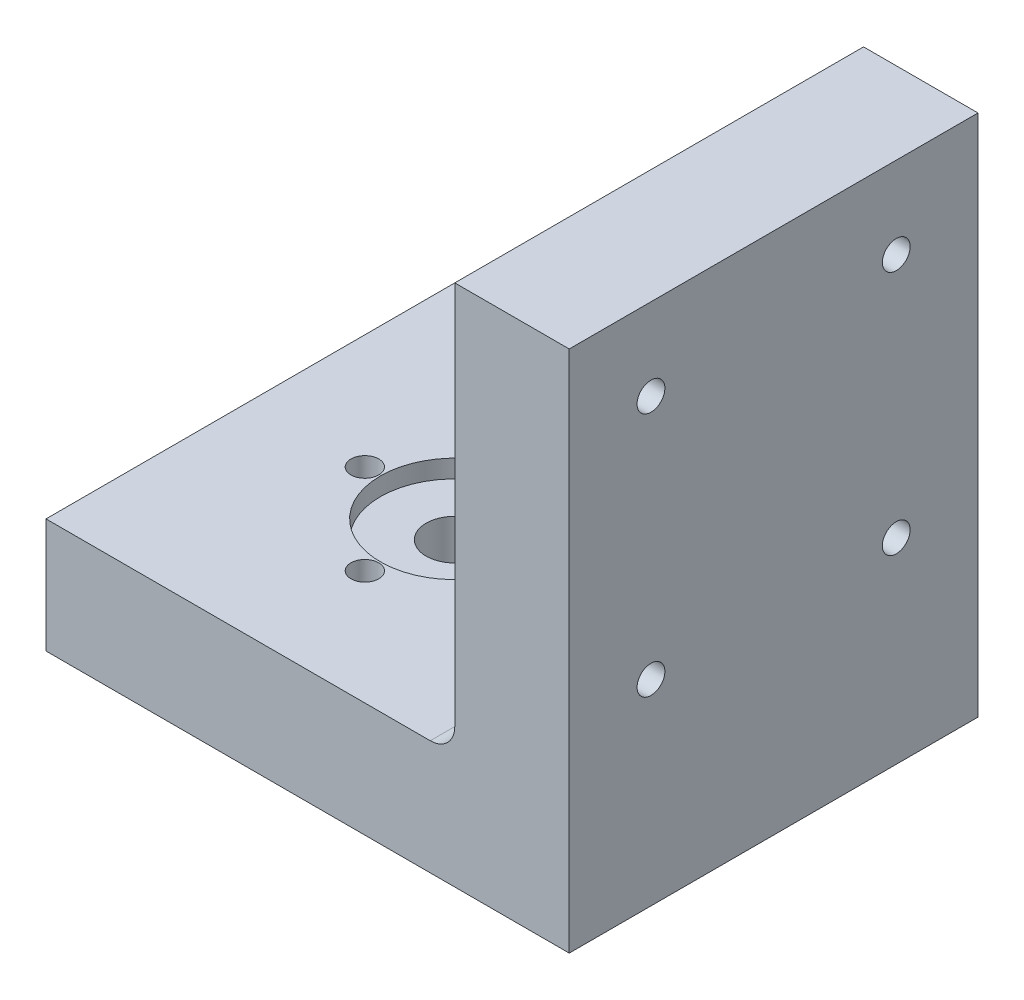
ISO-10303-21;
HEADER;
FILE_DESCRIPTION(('STEP AP214'),'2;1');
FILE_NAME('part.step','',(''),(''),'','','');
FILE_SCHEMA(('AUTOMOTIVE_DESIGN { 1 0 10303 214 1 1 1 1 }'));
ENDSEC;
DATA;
#1=APPLICATION_CONTEXT('core data for automotive mechanical design processes');
#2=APPLICATION_PROTOCOL_DEFINITION('international standard','automotive_design',2000,#1);
#3=PRODUCT_CONTEXT('',#1,'mechanical');
#4=PRODUCT('Part','Part','',(#3));
#5=PRODUCT_RELATED_PRODUCT_CATEGORY('part','',(#4));
#6=PRODUCT_DEFINITION_FORMATION('','',#4);
#7=PRODUCT_DEFINITION_CONTEXT('part definition',#1,'design');
#8=PRODUCT_DEFINITION('design','',#6,#7);
#9=PRODUCT_DEFINITION_SHAPE('','',#8);
#10=(LENGTH_UNIT() NAMED_UNIT(*) SI_UNIT(.MILLI.,.METRE.));
#11=(NAMED_UNIT(*) PLANE_ANGLE_UNIT() SI_UNIT($,.RADIAN.));
#12=(NAMED_UNIT(*) SI_UNIT($,.STERADIAN.) SOLID_ANGLE_UNIT());
#13=UNCERTAINTY_MEASURE_WITH_UNIT(LENGTH_MEASURE(1.E-05),#10,'distance_accuracy_value','');
#14=(GEOMETRIC_REPRESENTATION_CONTEXT(3) GLOBAL_UNCERTAINTY_ASSIGNED_CONTEXT((#13)) GLOBAL_UNIT_ASSIGNED_CONTEXT((#10,
#11,#12)) REPRESENTATION_CONTEXT('',''));
#15=CARTESIAN_POINT('',(0.,0.,0.));
#16=DIRECTION('',(0.,0.,1.));
#17=DIRECTION('',(1.,0.,0.));
#18=AXIS2_PLACEMENT_3D('',#15,#16,#17);
#19=CARTESIAN_POINT('',(-8.99999999999999,-7.,0.));
#20=DIRECTION('',(0.,1.,0.));
#21=DIRECTION('',(-1.,0.,0.));
#22=AXIS2_PLACEMENT_3D('',#19,#20,#21);
#23=CYLINDRICAL_SURFACE('',#22,3.5);
#24=CARTESIAN_POINT('',(-8.99999999999999,-7.,0.));
#25=DIRECTION('',(0.,1.,0.));
#26=DIRECTION('',(-1.,0.,0.));
#27=AXIS2_PLACEMENT_3D('',#24,#25,#26);
#28=CIRCLE('',#27,3.5);
#29=CARTESIAN_POINT('',(-12.5,-7.00000000000001,0.));
#30=VERTEX_POINT('',#29);
#31=EDGE_CURVE('E153',#30,#30,#28,.T.);
#32=ORIENTED_EDGE('',*,*,#31,.F.);
#33=EDGE_LOOP('',(#32));
#34=FACE_BOUND('',#33,.T.);
#35=CARTESIAN_POINT('',(-9.,4.8,0.));
#36=DIRECTION('',(0.,1.,0.));
#37=DIRECTION('',(-1.,0.,0.));
#38=AXIS2_PLACEMENT_3D('',#35,#36,#37);
#39=CIRCLE('',#38,3.5);
#40=CARTESIAN_POINT('',(-12.5,4.79999999999999,0.));
#41=VERTEX_POINT('',#40);
#42=EDGE_CURVE('E180',#41,#41,#39,.F.);
#43=ORIENTED_EDGE('',*,*,#42,.F.);
#44=EDGE_LOOP('',(#43));
#45=FACE_BOUND('',#44,.T.);
#46=ADVANCED_FACE('F47',(#34,#45),#23,.F.);
#47=CARTESIAN_POINT('',(30.,7.,25.));
#48=DIRECTION('',(-1.,0.,0.));
#49=DIRECTION('',(0.,0.,1.));
#50=AXIS2_PLACEMENT_3D('',#47,#48,#49);
#51=PLANE('',#50);
#52=CARTESIAN_POINT('',(30.,47.,15.));
#53=DIRECTION('',(-1.,0.,0.));
#54=DIRECTION('',(0.,0.,1.));
#55=AXIS2_PLACEMENT_3D('',#52,#53,#54);
#56=CIRCLE('',#55,1.7);
#57=CARTESIAN_POINT('',(30.,47.,16.7));
#58=VERTEX_POINT('',#57);
#59=EDGE_CURVE('E184',#58,#58,#56,.T.);
#60=ORIENTED_EDGE('',*,*,#59,.T.);
#61=EDGE_LOOP('',(#60));
#62=FACE_BOUND('',#61,.T.);
#63=CARTESIAN_POINT('',(30.,17.,15.));
#64=DIRECTION('',(-1.,0.,0.));
#65=DIRECTION('',(0.,0.,1.));
#66=AXIS2_PLACEMENT_3D('',#63,#64,#65);
#67=CIRCLE('',#66,1.7);
#68=CARTESIAN_POINT('',(30.,17.,16.7));
#69=VERTEX_POINT('',#68);
#70=EDGE_CURVE('E312',#69,#69,#67,.T.);
#71=ORIENTED_EDGE('',*,*,#70,.T.);
#72=EDGE_LOOP('',(#71));
#73=FACE_BOUND('',#72,.T.);
#74=CARTESIAN_POINT('',(30.,17.,-15.));
#75=DIRECTION('',(-1.,0.,0.));
#76=DIRECTION('',(0.,0.,1.));
#77=AXIS2_PLACEMENT_3D('',#74,#75,#76);
#78=CIRCLE('',#77,1.7);
#79=CARTESIAN_POINT('',(30.,17.,-13.3));
#80=VERTEX_POINT('',#79);
#81=EDGE_CURVE('E300',#80,#80,#78,.T.);
#82=ORIENTED_EDGE('',*,*,#81,.T.);
#83=EDGE_LOOP('',(#82));
#84=FACE_BOUND('',#83,.T.);
#85=CARTESIAN_POINT('',(30.,47.,-15.));
#86=DIRECTION('',(-1.,0.,0.));
#87=DIRECTION('',(0.,0.,1.));
#88=AXIS2_PLACEMENT_3D('',#85,#86,#87);
#89=CIRCLE('',#88,1.7);
#90=CARTESIAN_POINT('',(30.,47.,-13.3));
#91=VERTEX_POINT('',#90);
#92=EDGE_CURVE('E282',#91,#91,#89,.T.);
#93=ORIENTED_EDGE('',*,*,#92,.T.);
#94=EDGE_LOOP('',(#93));
#95=FACE_BOUND('',#94,.T.);
#96=DIRECTION('',(0.,1.,0.));
#97=VECTOR('',#96,1.);
#98=CARTESIAN_POINT('',(30.,7.,-25.));
#99=LINE('',#98,#97);
#100=CARTESIAN_POINT('',(30.,-7.,-25.));
#101=VERTEX_POINT('',#100);
#102=CARTESIAN_POINT('',(30.,57.,-25.));
#103=VERTEX_POINT('',#102);
#104=EDGE_CURVE('E123',#101,#103,#99,.T.);
#105=ORIENTED_EDGE('',*,*,#104,.T.);
#106=DIRECTION('',(0.,0.,-1.));
#107=VECTOR('',#106,1.);
#108=CARTESIAN_POINT('',(30.,57.,25.));
#109=LINE('',#108,#107);
#110=CARTESIAN_POINT('',(30.,57.,25.));
#111=VERTEX_POINT('',#110);
#112=EDGE_CURVE('E121',#111,#103,#109,.T.);
#113=ORIENTED_EDGE('',*,*,#112,.F.);
#114=DIRECTION('',(0.,1.,0.));
#115=VECTOR('',#114,1.);
#116=CARTESIAN_POINT('',(30.,7.,25.));
#117=LINE('',#116,#115);
#118=CARTESIAN_POINT('',(30.,-7.,25.));
#119=VERTEX_POINT('',#118);
#120=EDGE_CURVE('E106',#119,#111,#117,.T.);
#121=ORIENTED_EDGE('',*,*,#120,.F.);
#122=DIRECTION('',(0.,0.,-1.));
#123=VECTOR('',#122,1.);
#124=CARTESIAN_POINT('',(30.,-7.,25.));
#125=LINE('',#124,#123);
#126=EDGE_CURVE('E149',#119,#101,#125,.T.);
#127=ORIENTED_EDGE('',*,*,#126,.T.);
#128=EDGE_LOOP('',(#105,#113,#121,#127));
#129=FACE_BOUND('',#128,.T.);
#130=ADVANCED_FACE('F122',(#62,#73,#84,#95,#129),#51,.F.);
#131=CARTESIAN_POINT('',(30.,57.,25.));
#132=DIRECTION('',(0.,-1.,0.));
#133=DIRECTION('',(1.,0.,0.));
#134=AXIS2_PLACEMENT_3D('',#131,#132,#133);
#135=PLANE('',#134);
#136=DIRECTION('',(-1.,0.,0.));
#137=VECTOR('',#136,1.);
#138=CARTESIAN_POINT('',(30.,57.,-25.));
#139=LINE('',#138,#137);
#140=CARTESIAN_POINT('',(16.,57.,-25.));
#141=VERTEX_POINT('',#140);
#142=EDGE_CURVE('E152',#103,#141,#139,.T.);
#143=ORIENTED_EDGE('',*,*,#142,.T.);
#144=DIRECTION('',(0.,0.,-1.));
#145=VECTOR('',#144,1.);
#146=CARTESIAN_POINT('',(16.,57.,25.));
#147=LINE('',#146,#145);
#148=CARTESIAN_POINT('',(16.,57.,25.));
#149=VERTEX_POINT('',#148);
#150=EDGE_CURVE('E128',#149,#141,#147,.T.);
#151=ORIENTED_EDGE('',*,*,#150,.F.);
#152=DIRECTION('',(-1.,0.,0.));
#153=VECTOR('',#152,1.);
#154=CARTESIAN_POINT('',(30.,57.,25.));
#155=LINE('',#154,#153);
#156=EDGE_CURVE('E110',#111,#149,#155,.T.);
#157=ORIENTED_EDGE('',*,*,#156,.F.);
#158=ORIENTED_EDGE('',*,*,#112,.T.);
#159=EDGE_LOOP('',(#143,#151,#157,#158));
#160=FACE_BOUND('',#159,.T.);
#161=ADVANCED_FACE('F130',(#160),#135,.F.);
#162=CARTESIAN_POINT('',(16.,7.,25.));
#163=DIRECTION('',(1.,0.,0.));
#164=DIRECTION('',(0.,0.,-1.));
#165=AXIS2_PLACEMENT_3D('',#162,#163,#164);
#166=PLANE('',#165);
#167=CARTESIAN_POINT('',(16.,47.,15.));
#168=DIRECTION('',(-1.,0.,0.));
#169=DIRECTION('',(0.,0.,1.));
#170=AXIS2_PLACEMENT_3D('',#167,#168,#169);
#171=CIRCLE('',#170,1.7);
#172=CARTESIAN_POINT('',(16.,47.,16.7));
#173=VERTEX_POINT('',#172);
#174=EDGE_CURVE('E318',#173,#173,#171,.T.);
#175=ORIENTED_EDGE('',*,*,#174,.F.);
#176=EDGE_LOOP('',(#175));
#177=FACE_BOUND('',#176,.T.);
#178=CARTESIAN_POINT('',(16.,17.,15.));
#179=DIRECTION('',(-1.,0.,0.));
#180=DIRECTION('',(0.,0.,1.));
#181=AXIS2_PLACEMENT_3D('',#178,#179,#180);
#182=CIRCLE('',#181,1.7);
#183=CARTESIAN_POINT('',(16.,17.,16.7));
#184=VERTEX_POINT('',#183);
#185=EDGE_CURVE('E306',#184,#184,#182,.T.);
#186=ORIENTED_EDGE('',*,*,#185,.F.);
#187=EDGE_LOOP('',(#186));
#188=FACE_BOUND('',#187,.T.);
#189=CARTESIAN_POINT('',(16.,17.,-15.));
#190=DIRECTION('',(-1.,0.,0.));
#191=DIRECTION('',(0.,0.,1.));
#192=AXIS2_PLACEMENT_3D('',#189,#190,#191);
#193=CIRCLE('',#192,1.7);
#194=CARTESIAN_POINT('',(16.,17.,-13.3));
#195=VERTEX_POINT('',#194);
#196=EDGE_CURVE('E294',#195,#195,#193,.T.);
#197=ORIENTED_EDGE('',*,*,#196,.F.);
#198=EDGE_LOOP('',(#197));
#199=FACE_BOUND('',#198,.T.);
#200=CARTESIAN_POINT('',(16.,47.,-15.));
#201=DIRECTION('',(-1.,0.,0.));
#202=DIRECTION('',(0.,0.,1.));
#203=AXIS2_PLACEMENT_3D('',#200,#201,#202);
#204=CIRCLE('',#203,1.7);
#205=CARTESIAN_POINT('',(16.,47.,-13.3));
#206=VERTEX_POINT('',#205);
#207=EDGE_CURVE('E288',#206,#206,#204,.T.);
#208=ORIENTED_EDGE('',*,*,#207,.F.);
#209=EDGE_LOOP('',(#208));
#210=FACE_BOUND('',#209,.T.);
#211=DIRECTION('',(0.,-1.,0.));
#212=VECTOR('',#211,1.);
#213=CARTESIAN_POINT('',(16.,7.,-25.));
#214=LINE('',#213,#212);
#215=CARTESIAN_POINT('',(16.,10.,-25.));
#216=VERTEX_POINT('',#215);
#217=EDGE_CURVE('E156',#141,#216,#214,.T.);
#218=ORIENTED_EDGE('',*,*,#217,.T.);
#219=DIRECTION('',(0.,0.,-1.));
#220=VECTOR('',#219,1.);
#221=CARTESIAN_POINT('',(16.,10.,25.));
#222=LINE('',#221,#220);
#223=CARTESIAN_POINT('',(16.,10.,25.));
#224=VERTEX_POINT('',#223);
#225=EDGE_CURVE('E63',#216,#224,#222,.F.);
#226=ORIENTED_EDGE('',*,*,#225,.T.);
#227=DIRECTION('',(0.,-1.,0.));
#228=VECTOR('',#227,1.);
#229=CARTESIAN_POINT('',(16.,7.,25.));
#230=LINE('',#229,#228);
#231=EDGE_CURVE('E133',#149,#224,#230,.T.);
#232=ORIENTED_EDGE('',*,*,#231,.F.);
#233=ORIENTED_EDGE('',*,*,#150,.T.);
#234=EDGE_LOOP('',(#218,#226,#232,#233));
#235=FACE_BOUND('',#234,.T.);
#236=ADVANCED_FACE('F351',(#177,#188,#199,#210,#235),#166,.F.);
#237=CARTESIAN_POINT('',(-34.,6.99999999999999,25.));
#238=DIRECTION('',(0.,-1.,0.));
#239=DIRECTION('',(1.,0.,0.));
#240=AXIS2_PLACEMENT_3D('',#237,#238,#239);
#241=PLANE('',#240);
#242=CARTESIAN_POINT('',(-9.,7.,0.));
#243=DIRECTION('',(0.,1.,0.));
#244=DIRECTION('',(-1.,0.,0.));
#245=AXIS2_PLACEMENT_3D('',#242,#243,#244);
#246=CIRCLE('',#245,9.1);
#247=CARTESIAN_POINT('',(-18.1,6.99999999999999,0.));
#248=VERTEX_POINT('',#247);
#249=EDGE_CURVE('E336',#248,#248,#246,.T.);
#250=ORIENTED_EDGE('',*,*,#249,.F.);
#251=EDGE_LOOP('',(#250));
#252=FACE_BOUND('',#251,.T.);
#253=CARTESIAN_POINT('',(-9.,7.,-11.));
#254=DIRECTION('',(0.,1.,0.));
#255=DIRECTION('',(-1.,0.,0.));
#256=AXIS2_PLACEMENT_3D('',#253,#254,#255);
#257=CIRCLE('',#256,1.7);
#258=CARTESIAN_POINT('',(-10.7,7.,-11.));
#259=VERTEX_POINT('',#258);
#260=EDGE_CURVE('E240',#259,#259,#257,.T.);
#261=ORIENTED_EDGE('',*,*,#260,.F.);
#262=EDGE_LOOP('',(#261));
#263=FACE_BOUND('',#262,.T.);
#264=CARTESIAN_POINT('',(-19.9999999999998,6.99999999999999,1.94289029309402E-13));
#265=DIRECTION('',(0.,1.,0.));
#266=DIRECTION('',(-1.,0.,0.));
#267=AXIS2_PLACEMENT_3D('',#264,#265,#266);
#268=CIRCLE('',#267,1.7);
#269=CARTESIAN_POINT('',(-21.6999999999998,6.99999999999999,1.94289029309402E-13));
#270=VERTEX_POINT('',#269);
#271=EDGE_CURVE('E246',#270,#270,#268,.T.);
#272=ORIENTED_EDGE('',*,*,#271,.F.);
#273=EDGE_LOOP('',(#272));
#274=FACE_BOUND('',#273,.T.);
#275=CARTESIAN_POINT('',(-9.,7.,11.));
#276=DIRECTION('',(0.,1.,0.));
#277=DIRECTION('',(-1.,0.,0.));
#278=AXIS2_PLACEMENT_3D('',#275,#276,#277);
#279=CIRCLE('',#278,1.69999999999963);
#280=CARTESIAN_POINT('',(-10.6999999999996,7.,11.));
#281=VERTEX_POINT('',#280);
#282=EDGE_CURVE('E258',#281,#281,#279,.T.);
#283=ORIENTED_EDGE('',*,*,#282,.F.);
#284=EDGE_LOOP('',(#283));
#285=FACE_BOUND('',#284,.T.);
#286=CARTESIAN_POINT('',(2.,7.,0.));
#287=DIRECTION('',(0.,1.,0.));
#288=DIRECTION('',(-1.,0.,0.));
#289=AXIS2_PLACEMENT_3D('',#286,#287,#288);
#290=CIRCLE('',#289,1.69999999999979);
#291=CARTESIAN_POINT('',(0.300000000000213,7.,0.));
#292=VERTEX_POINT('',#291);
#293=EDGE_CURVE('E270',#292,#292,#290,.T.);
#294=ORIENTED_EDGE('',*,*,#293,.F.);
#295=EDGE_LOOP('',(#294));
#296=FACE_BOUND('',#295,.T.);
#297=DIRECTION('',(-1.,0.,0.));
#298=VECTOR('',#297,1.);
#299=CARTESIAN_POINT('',(-34.,6.99999999999999,25.));
#300=LINE('',#299,#298);
#301=CARTESIAN_POINT('',(13.,7.,25.));
#302=VERTEX_POINT('',#301);
#303=CARTESIAN_POINT('',(-34.,6.99999999999999,25.));
#304=VERTEX_POINT('',#303);
#305=EDGE_CURVE('E138',#302,#304,#300,.T.);
#306=ORIENTED_EDGE('',*,*,#305,.F.);
#307=DIRECTION('',(0.,0.,-1.));
#308=VECTOR('',#307,1.);
#309=CARTESIAN_POINT('',(13.,7.,-25.));
#310=LINE('',#309,#308);
#311=CARTESIAN_POINT('',(13.,7.,-25.));
#312=VERTEX_POINT('',#311);
#313=EDGE_CURVE('E127',#302,#312,#310,.T.);
#314=ORIENTED_EDGE('',*,*,#313,.T.);
#315=DIRECTION('',(-1.,0.,0.));
#316=VECTOR('',#315,1.);
#317=CARTESIAN_POINT('',(-34.,6.99999999999999,-25.));
#318=LINE('',#317,#316);
#319=CARTESIAN_POINT('',(-34.,6.99999999999999,-25.));
#320=VERTEX_POINT('',#319);
#321=EDGE_CURVE('E159',#312,#320,#318,.T.);
#322=ORIENTED_EDGE('',*,*,#321,.T.);
#323=DIRECTION('',(0.,0.,-1.));
#324=VECTOR('',#323,1.);
#325=CARTESIAN_POINT('',(-34.,6.99999999999999,25.));
#326=LINE('',#325,#324);
#327=EDGE_CURVE('E174',#304,#320,#326,.T.);
#328=ORIENTED_EDGE('',*,*,#327,.F.);
#329=EDGE_LOOP('',(#306,#314,#322,#328));
#330=FACE_BOUND('',#329,.T.);
#331=ADVANCED_FACE('F347',(#252,#263,#274,#285,#296,#330),#241,.F.);
#332=CARTESIAN_POINT('',(-34.,6.99999999999999,25.));
#333=DIRECTION('',(1.,0.,0.));
#334=DIRECTION('',(0.,0.,-1.));
#335=AXIS2_PLACEMENT_3D('',#332,#333,#334);
#336=PLANE('',#335);
#337=DIRECTION('',(0.,-1.,0.));
#338=VECTOR('',#337,1.);
#339=CARTESIAN_POINT('',(-34.,6.99999999999999,-25.));
#340=LINE('',#339,#338);
#341=CARTESIAN_POINT('',(-34.,-6.99999999999999,-25.));
#342=VERTEX_POINT('',#341);
#343=EDGE_CURVE('E162',#320,#342,#340,.T.);
#344=ORIENTED_EDGE('',*,*,#343,.T.);
#345=DIRECTION('',(0.,0.,-1.));
#346=VECTOR('',#345,1.);
#347=CARTESIAN_POINT('',(-34.,-6.99999999999999,25.));
#348=LINE('',#347,#346);
#349=CARTESIAN_POINT('',(-34.,-6.99999999999999,25.));
#350=VERTEX_POINT('',#349);
#351=EDGE_CURVE('E170',#350,#342,#348,.T.);
#352=ORIENTED_EDGE('',*,*,#351,.F.);
#353=DIRECTION('',(0.,-1.,0.));
#354=VECTOR('',#353,1.);
#355=CARTESIAN_POINT('',(-34.,6.99999999999999,25.));
#356=LINE('',#355,#354);
#357=EDGE_CURVE('E144',#304,#350,#356,.T.);
#358=ORIENTED_EDGE('',*,*,#357,.F.);
#359=ORIENTED_EDGE('',*,*,#327,.T.);
#360=EDGE_LOOP('',(#344,#352,#358,#359));
#361=FACE_BOUND('',#360,.T.);
#362=ADVANCED_FACE('F350',(#361),#336,.F.);
#363=CARTESIAN_POINT('',(-34.,-6.99999999999999,25.));
#364=DIRECTION('',(0.,1.,0.));
#365=DIRECTION('',(-1.,0.,0.));
#366=AXIS2_PLACEMENT_3D('',#363,#364,#365);
#367=PLANE('',#366);
#368=CARTESIAN_POINT('',(-8.99999999999999,-7.00000000000001,-11.));
#369=DIRECTION('',(0.,1.,0.));
#370=DIRECTION('',(-1.,0.,0.));
#371=AXIS2_PLACEMENT_3D('',#368,#369,#370);
#372=CIRCLE('',#371,1.7);
#373=CARTESIAN_POINT('',(-10.7,-7.00000000000001,-11.));
#374=VERTEX_POINT('',#373);
#375=EDGE_CURVE('E235',#374,#374,#372,.T.);
#376=ORIENTED_EDGE('',*,*,#375,.T.);
#377=EDGE_LOOP('',(#376));
#378=FACE_BOUND('',#377,.T.);
#379=CARTESIAN_POINT('',(-19.9999999999998,-7.00000000000001,1.94289029309402E-13));
#380=DIRECTION('',(0.,1.,0.));
#381=DIRECTION('',(-1.,0.,0.));
#382=AXIS2_PLACEMENT_3D('',#379,#380,#381);
#383=CIRCLE('',#382,1.7);
#384=CARTESIAN_POINT('',(-21.6999999999998,-7.00000000000001,1.94289029309402E-13));
#385=VERTEX_POINT('',#384);
#386=EDGE_CURVE('E252',#385,#385,#383,.T.);
#387=ORIENTED_EDGE('',*,*,#386,.T.);
#388=EDGE_LOOP('',(#387));
#389=FACE_BOUND('',#388,.T.);
#390=CARTESIAN_POINT('',(-9.,-7.00000000000001,11.));
#391=DIRECTION('',(0.,1.,0.));
#392=DIRECTION('',(-1.,0.,0.));
#393=AXIS2_PLACEMENT_3D('',#390,#391,#392);
#394=CIRCLE('',#393,1.69999999999963);
#395=CARTESIAN_POINT('',(-10.6999999999996,-7.00000000000001,11.));
#396=VERTEX_POINT('',#395);
#397=EDGE_CURVE('E264',#396,#396,#394,.T.);
#398=ORIENTED_EDGE('',*,*,#397,.T.);
#399=EDGE_LOOP('',(#398));
#400=FACE_BOUND('',#399,.T.);
#401=CARTESIAN_POINT('',(2.,-7.00000000000001,0.));
#402=DIRECTION('',(0.,1.,0.));
#403=DIRECTION('',(-1.,0.,0.));
#404=AXIS2_PLACEMENT_3D('',#401,#402,#403);
#405=CIRCLE('',#404,1.69999999999979);
#406=CARTESIAN_POINT('',(0.300000000000215,-7.00000000000001,0.));
#407=VERTEX_POINT('',#406);
#408=EDGE_CURVE('E276',#407,#407,#405,.T.);
#409=ORIENTED_EDGE('',*,*,#408,.T.);
#410=EDGE_LOOP('',(#409));
#411=FACE_BOUND('',#410,.T.);
#412=ORIENTED_EDGE('',*,*,#31,.T.);
#413=EDGE_LOOP('',(#412));
#414=FACE_BOUND('',#413,.T.);
#415=DIRECTION('',(1.,0.,0.));
#416=VECTOR('',#415,1.);
#417=CARTESIAN_POINT('',(-34.,-6.99999999999999,-25.));
#418=LINE('',#417,#416);
#419=EDGE_CURVE('E118',#342,#101,#418,.T.);
#420=ORIENTED_EDGE('',*,*,#419,.T.);
#421=ORIENTED_EDGE('',*,*,#126,.F.);
#422=DIRECTION('',(1.,0.,0.));
#423=VECTOR('',#422,1.);
#424=CARTESIAN_POINT('',(-34.,-6.99999999999999,25.));
#425=LINE('',#424,#423);
#426=EDGE_CURVE('E113',#350,#119,#425,.T.);
#427=ORIENTED_EDGE('',*,*,#426,.F.);
#428=ORIENTED_EDGE('',*,*,#351,.T.);
#429=EDGE_LOOP('',(#420,#421,#427,#428));
#430=FACE_BOUND('',#429,.T.);
#431=ADVANCED_FACE('F371',(#378,#389,#400,#411,#414,#430),#367,.F.);
#432=CARTESIAN_POINT('',(0.,0.,25.));
#433=DIRECTION('',(0.,0.,1.));
#434=DIRECTION('',(1.,0.,0.));
#435=AXIS2_PLACEMENT_3D('',#432,#433,#434);
#436=PLANE('',#435);
#437=ORIENTED_EDGE('',*,*,#120,.T.);
#438=ORIENTED_EDGE('',*,*,#156,.T.);
#439=ORIENTED_EDGE('',*,*,#231,.T.);
#440=CARTESIAN_POINT('',(13.,10.,25.));
#441=DIRECTION('',(0.,0.,1.));
#442=DIRECTION('',(1.,0.,0.));
#443=AXIS2_PLACEMENT_3D('',#440,#441,#442);
#444=CIRCLE('',#443,3.);
#445=EDGE_CURVE('E11',#224,#302,#444,.F.);
#446=ORIENTED_EDGE('',*,*,#445,.T.);
#447=ORIENTED_EDGE('',*,*,#305,.T.);
#448=ORIENTED_EDGE('',*,*,#357,.T.);
#449=ORIENTED_EDGE('',*,*,#426,.T.);
#450=EDGE_LOOP('',(#437,#438,#439,#446,#447,#448,#449));
#451=FACE_BOUND('',#450,.T.);
#452=ADVANCED_FACE('F108',(#451),#436,.T.);
#453=CARTESIAN_POINT('',(0.,0.,-25.));
#454=DIRECTION('',(0.,0.,1.));
#455=DIRECTION('',(1.,0.,0.));
#456=AXIS2_PLACEMENT_3D('',#453,#454,#455);
#457=PLANE('',#456);
#458=ORIENTED_EDGE('',*,*,#104,.F.);
#459=ORIENTED_EDGE('',*,*,#419,.F.);
#460=ORIENTED_EDGE('',*,*,#343,.F.);
#461=ORIENTED_EDGE('',*,*,#321,.F.);
#462=CARTESIAN_POINT('',(13.,10.,-25.));
#463=DIRECTION('',(0.,0.,1.));
#464=DIRECTION('',(1.,0.,0.));
#465=AXIS2_PLACEMENT_3D('',#462,#463,#464);
#466=CIRCLE('',#465,3.);
#467=EDGE_CURVE('E56',#312,#216,#466,.T.);
#468=ORIENTED_EDGE('',*,*,#467,.T.);
#469=ORIENTED_EDGE('',*,*,#217,.F.);
#470=ORIENTED_EDGE('',*,*,#142,.F.);
#471=EDGE_LOOP('',(#458,#459,#460,#461,#468,#469,#470));
#472=FACE_BOUND('',#471,.T.);
#473=ADVANCED_FACE('F367',(#472),#457,.F.);
#474=CARTESIAN_POINT('',(2.,-7.00000000000001,0.));
#475=DIRECTION('',(0.,1.,0.));
#476=DIRECTION('',(-1.,0.,0.));
#477=AXIS2_PLACEMENT_3D('',#474,#475,#476);
#478=CYLINDRICAL_SURFACE('',#477,1.69999999999979);
#479=ORIENTED_EDGE('',*,*,#408,.F.);
#480=EDGE_LOOP('',(#479));
#481=FACE_BOUND('',#480,.T.);
#482=ORIENTED_EDGE('',*,*,#293,.T.);
#483=EDGE_LOOP('',(#482));
#484=FACE_BOUND('',#483,.T.);
#485=ADVANCED_FACE('F395',(#481,#484),#478,.F.);
#486=CARTESIAN_POINT('',(-9.,-7.00000000000001,11.));
#487=DIRECTION('',(0.,1.,0.));
#488=DIRECTION('',(-1.,0.,0.));
#489=AXIS2_PLACEMENT_3D('',#486,#487,#488);
#490=CYLINDRICAL_SURFACE('',#489,1.69999999999963);
#491=ORIENTED_EDGE('',*,*,#397,.F.);
#492=EDGE_LOOP('',(#491));
#493=FACE_BOUND('',#492,.T.);
#494=ORIENTED_EDGE('',*,*,#282,.T.);
#495=EDGE_LOOP('',(#494));
#496=FACE_BOUND('',#495,.T.);
#497=ADVANCED_FACE('F404',(#493,#496),#490,.F.);
#498=CARTESIAN_POINT('',(-19.9999999999998,-7.00000000000001,1.94289029309402E-13));
#499=DIRECTION('',(0.,1.,0.));
#500=DIRECTION('',(-1.,0.,0.));
#501=AXIS2_PLACEMENT_3D('',#498,#499,#500);
#502=CYLINDRICAL_SURFACE('',#501,1.7);
#503=ORIENTED_EDGE('',*,*,#386,.F.);
#504=EDGE_LOOP('',(#503));
#505=FACE_BOUND('',#504,.T.);
#506=ORIENTED_EDGE('',*,*,#271,.T.);
#507=EDGE_LOOP('',(#506));
#508=FACE_BOUND('',#507,.T.);
#509=ADVANCED_FACE('F409',(#505,#508),#502,.F.);
#510=CARTESIAN_POINT('',(-8.99999999999999,-7.00000000000001,-11.));
#511=DIRECTION('',(0.,1.,0.));
#512=DIRECTION('',(-1.,0.,0.));
#513=AXIS2_PLACEMENT_3D('',#510,#511,#512);
#514=CYLINDRICAL_SURFACE('',#513,1.7);
#515=ORIENTED_EDGE('',*,*,#375,.F.);
#516=EDGE_LOOP('',(#515));
#517=FACE_BOUND('',#516,.T.);
#518=ORIENTED_EDGE('',*,*,#260,.T.);
#519=EDGE_LOOP('',(#518));
#520=FACE_BOUND('',#519,.T.);
#521=ADVANCED_FACE('F418',(#517,#520),#514,.F.);
#522=CARTESIAN_POINT('',(30.,47.,-15.));
#523=DIRECTION('',(-1.,0.,0.));
#524=DIRECTION('',(0.,0.,1.));
#525=AXIS2_PLACEMENT_3D('',#522,#523,#524);
#526=CYLINDRICAL_SURFACE('',#525,1.7);
#527=CARTESIAN_POINT('',(30.,47.,-13.3));
#528=CARTESIAN_POINT('',(29.8541666666667,47.,-13.3));
#529=CARTESIAN_POINT('',(29.7083333333333,47.,-13.3));
#530=CARTESIAN_POINT('',(29.4166666666667,47.,-13.3));
#531=CARTESIAN_POINT('',(29.2708333333333,47.,-13.3));
#532=CARTESIAN_POINT('',(28.9791666666667,47.,-13.3));
#533=CARTESIAN_POINT('',(28.8333333333333,47.,-13.3));
#534=CARTESIAN_POINT('',(28.5416666666667,47.,-13.3));
#535=CARTESIAN_POINT('',(28.3958333333333,47.,-13.3));
#536=CARTESIAN_POINT('',(28.1041666666667,47.,-13.3));
#537=CARTESIAN_POINT('',(27.9583333333333,47.,-13.3));
#538=CARTESIAN_POINT('',(27.6666666666667,47.,-13.3));
#539=CARTESIAN_POINT('',(27.5208333333333,47.,-13.3));
#540=CARTESIAN_POINT('',(27.2291666666667,47.,-13.3));
#541=CARTESIAN_POINT('',(27.0833333333333,47.,-13.3));
#542=CARTESIAN_POINT('',(26.7916666666667,47.,-13.3));
#543=CARTESIAN_POINT('',(26.6458333333333,47.,-13.3));
#544=CARTESIAN_POINT('',(26.3541666666667,47.,-13.3));
#545=CARTESIAN_POINT('',(26.2083333333333,47.,-13.3));
#546=CARTESIAN_POINT('',(25.9166666666667,47.,-13.3));
#547=CARTESIAN_POINT('',(25.7708333333333,47.,-13.3));
#548=CARTESIAN_POINT('',(25.4791666666667,47.,-13.3));
#549=CARTESIAN_POINT('',(25.3333333333333,47.,-13.3));
#550=CARTESIAN_POINT('',(25.0416666666667,47.,-13.3));
#551=CARTESIAN_POINT('',(24.8958333333333,47.,-13.3));
#552=CARTESIAN_POINT('',(24.6041666666667,47.,-13.3));
#553=CARTESIAN_POINT('',(24.4583333333333,47.,-13.3));
#554=CARTESIAN_POINT('',(24.1666666666667,47.,-13.3));
#555=CARTESIAN_POINT('',(24.0208333333333,47.,-13.3));
#556=CARTESIAN_POINT('',(23.7291666666667,47.,-13.3));
#557=CARTESIAN_POINT('',(23.5833333333333,47.,-13.3));
#558=CARTESIAN_POINT('',(23.2916666666667,47.,-13.3));
#559=CARTESIAN_POINT('',(23.1458333333333,47.,-13.3));
#560=CARTESIAN_POINT('',(22.8541666666667,47.,-13.3));
#561=CARTESIAN_POINT('',(22.7083333333333,47.,-13.3));
#562=CARTESIAN_POINT('',(22.4166666666667,47.,-13.3));
#563=CARTESIAN_POINT('',(22.2708333333333,47.,-13.3));
#564=CARTESIAN_POINT('',(21.9791666666667,47.,-13.3));
#565=CARTESIAN_POINT('',(21.8333333333333,47.,-13.3));
#566=CARTESIAN_POINT('',(21.5416666666667,47.,-13.3));
#567=CARTESIAN_POINT('',(21.3958333333333,47.,-13.3));
#568=CARTESIAN_POINT('',(21.1041666666667,47.,-13.3));
#569=CARTESIAN_POINT('',(20.9583333333333,47.,-13.3));
#570=CARTESIAN_POINT('',(20.6666666666667,47.,-13.3));
#571=CARTESIAN_POINT('',(20.5208333333333,47.,-13.3));
#572=CARTESIAN_POINT('',(20.2291666666667,47.,-13.3));
#573=CARTESIAN_POINT('',(20.0833333333333,47.,-13.3));
#574=CARTESIAN_POINT('',(19.7916666666667,47.,-13.3));
#575=CARTESIAN_POINT('',(19.6458333333333,47.,-13.3));
#576=CARTESIAN_POINT('',(19.3541666666667,47.,-13.3));
#577=CARTESIAN_POINT('',(19.2083333333333,47.,-13.3));
#578=CARTESIAN_POINT('',(18.9166666666667,47.,-13.3));
#579=CARTESIAN_POINT('',(18.7708333333333,47.,-13.3));
#580=CARTESIAN_POINT('',(18.4791666666667,47.,-13.3));
#581=CARTESIAN_POINT('',(18.3333333333333,47.,-13.3));
#582=CARTESIAN_POINT('',(18.0416666666667,47.,-13.3));
#583=CARTESIAN_POINT('',(17.8958333333333,47.,-13.3));
#584=CARTESIAN_POINT('',(17.6041666666667,47.,-13.3));
#585=CARTESIAN_POINT('',(17.4583333333333,47.,-13.3));
#586=CARTESIAN_POINT('',(17.1666666666667,47.,-13.3));
#587=CARTESIAN_POINT('',(17.0208333333333,47.,-13.3));
#588=CARTESIAN_POINT('',(16.7291666666667,47.,-13.3));
#589=CARTESIAN_POINT('',(16.5833333333333,47.,-13.3));
#590=CARTESIAN_POINT('',(16.2916666666667,47.,-13.3));
#591=CARTESIAN_POINT('',(16.1458333333333,47.,-13.3));
#592=CARTESIAN_POINT('',(16.,47.,-13.3));
#593=B_SPLINE_CURVE_WITH_KNOTS('',3,(#527,#528,#529,#530,#531,#532,#533,#534,#535,#536,#537,
#538,#539,#540,#541,#542,#543,#544,#545,#546,#547,#548,#549,#550,#551,#552,#553,#554,#555,#556,
#557,#558,#559,#560,#561,#562,#563,#564,#565,#566,#567,#568,#569,#570,#571,#572,#573,#574,#575,
#576,#577,#578,#579,#580,#581,#582,#583,#584,#585,#586,#587,#588,#589,#590,#591,#592),
.UNSPECIFIED.,.F.,.F.,(4,2,2,2,2,2,2,2,2,2,2,2,2,2,2,2,2,2,2,2,2,2,2,2,2,2,2,2,2,2,2,2,4),(0.,
0.4375,0.875000000000001,1.3125,1.75,2.1875,2.625,3.0625,3.5,3.9375,4.375,4.8125,5.25,5.6875,
6.125,6.5625,7.,7.4375,7.875,8.3125,8.75,9.1875,9.625,10.0625,10.5,10.9375,11.375,11.8125,12.25,
12.6875,13.125,13.5625,14.),.UNSPECIFIED.);
#594=EDGE_CURVE('BSEAM426',#91,#206,#593,.T.);
#595=ORIENTED_EDGE('',*,*,#92,.F.);
#596=ORIENTED_EDGE('',*,*,#207,.T.);
#597=ORIENTED_EDGE('',*,*,#594,.T.);
#598=ORIENTED_EDGE('',*,*,#594,.F.);
#599=EDGE_LOOP('',(#595,#597,#596,#598));
#600=FACE_BOUND('',#599,.T.);
#601=ADVANCED_FACE('F426',(#600),#526,.F.);
#602=CARTESIAN_POINT('',(30.,17.,-15.));
#603=DIRECTION('',(-1.,0.,0.));
#604=DIRECTION('',(0.,0.,1.));
#605=AXIS2_PLACEMENT_3D('',#602,#603,#604);
#606=CYLINDRICAL_SURFACE('',#605,1.7);
#607=CARTESIAN_POINT('',(30.,17.,-13.3));
#608=CARTESIAN_POINT('',(29.8541666666667,17.,-13.3));
#609=CARTESIAN_POINT('',(29.7083333333333,17.,-13.3));
#610=CARTESIAN_POINT('',(29.4166666666667,17.,-13.3));
#611=CARTESIAN_POINT('',(29.2708333333333,17.,-13.3));
#612=CARTESIAN_POINT('',(28.9791666666667,17.,-13.3));
#613=CARTESIAN_POINT('',(28.8333333333333,17.,-13.3));
#614=CARTESIAN_POINT('',(28.5416666666667,17.,-13.3));
#615=CARTESIAN_POINT('',(28.3958333333333,17.,-13.3));
#616=CARTESIAN_POINT('',(28.1041666666667,17.,-13.3));
#617=CARTESIAN_POINT('',(27.9583333333333,17.,-13.3));
#618=CARTESIAN_POINT('',(27.6666666666667,17.,-13.3));
#619=CARTESIAN_POINT('',(27.5208333333333,17.,-13.3));
#620=CARTESIAN_POINT('',(27.2291666666667,17.,-13.3));
#621=CARTESIAN_POINT('',(27.0833333333333,17.,-13.3));
#622=CARTESIAN_POINT('',(26.7916666666667,17.,-13.3));
#623=CARTESIAN_POINT('',(26.6458333333333,17.,-13.3));
#624=CARTESIAN_POINT('',(26.3541666666667,17.,-13.3));
#625=CARTESIAN_POINT('',(26.2083333333333,17.,-13.3));
#626=CARTESIAN_POINT('',(25.9166666666667,17.,-13.3));
#627=CARTESIAN_POINT('',(25.7708333333333,17.,-13.3));
#628=CARTESIAN_POINT('',(25.4791666666667,17.,-13.3));
#629=CARTESIAN_POINT('',(25.3333333333333,17.,-13.3));
#630=CARTESIAN_POINT('',(25.0416666666667,17.,-13.3));
#631=CARTESIAN_POINT('',(24.8958333333333,17.,-13.3));
#632=CARTESIAN_POINT('',(24.6041666666667,17.,-13.3));
#633=CARTESIAN_POINT('',(24.4583333333333,17.,-13.3));
#634=CARTESIAN_POINT('',(24.1666666666667,17.,-13.3));
#635=CARTESIAN_POINT('',(24.0208333333333,17.,-13.3));
#636=CARTESIAN_POINT('',(23.7291666666667,17.,-13.3));
#637=CARTESIAN_POINT('',(23.5833333333333,17.,-13.3));
#638=CARTESIAN_POINT('',(23.2916666666667,17.,-13.3));
#639=CARTESIAN_POINT('',(23.1458333333333,17.,-13.3));
#640=CARTESIAN_POINT('',(22.8541666666667,17.,-13.3));
#641=CARTESIAN_POINT('',(22.7083333333333,17.,-13.3));
#642=CARTESIAN_POINT('',(22.4166666666667,17.,-13.3));
#643=CARTESIAN_POINT('',(22.2708333333333,17.,-13.3));
#644=CARTESIAN_POINT('',(21.9791666666667,17.,-13.3));
#645=CARTESIAN_POINT('',(21.8333333333333,17.,-13.3));
#646=CARTESIAN_POINT('',(21.5416666666667,17.,-13.3));
#647=CARTESIAN_POINT('',(21.3958333333333,17.,-13.3));
#648=CARTESIAN_POINT('',(21.1041666666667,17.,-13.3));
#649=CARTESIAN_POINT('',(20.9583333333333,17.,-13.3));
#650=CARTESIAN_POINT('',(20.6666666666667,17.,-13.3));
#651=CARTESIAN_POINT('',(20.5208333333333,17.,-13.3));
#652=CARTESIAN_POINT('',(20.2291666666667,17.,-13.3));
#653=CARTESIAN_POINT('',(20.0833333333333,17.,-13.3));
#654=CARTESIAN_POINT('',(19.7916666666667,17.,-13.3));
#655=CARTESIAN_POINT('',(19.6458333333333,17.,-13.3));
#656=CARTESIAN_POINT('',(19.3541666666667,17.,-13.3));
#657=CARTESIAN_POINT('',(19.2083333333333,17.,-13.3));
#658=CARTESIAN_POINT('',(18.9166666666667,17.,-13.3));
#659=CARTESIAN_POINT('',(18.7708333333333,17.,-13.3));
#660=CARTESIAN_POINT('',(18.4791666666667,17.,-13.3));
#661=CARTESIAN_POINT('',(18.3333333333333,17.,-13.3));
#662=CARTESIAN_POINT('',(18.0416666666667,17.,-13.3));
#663=CARTESIAN_POINT('',(17.8958333333333,17.,-13.3));
#664=CARTESIAN_POINT('',(17.6041666666667,17.,-13.3));
#665=CARTESIAN_POINT('',(17.4583333333333,17.,-13.3));
#666=CARTESIAN_POINT('',(17.1666666666667,17.,-13.3));
#667=CARTESIAN_POINT('',(17.0208333333333,17.,-13.3));
#668=CARTESIAN_POINT('',(16.7291666666667,17.,-13.3));
#669=CARTESIAN_POINT('',(16.5833333333333,17.,-13.3));
#670=CARTESIAN_POINT('',(16.2916666666667,17.,-13.3));
#671=CARTESIAN_POINT('',(16.1458333333333,17.,-13.3));
#672=CARTESIAN_POINT('',(16.,17.,-13.3));
#673=B_SPLINE_CURVE_WITH_KNOTS('',3,(#607,#608,#609,#610,#611,#612,#613,#614,#615,#616,#617,
#618,#619,#620,#621,#622,#623,#624,#625,#626,#627,#628,#629,#630,#631,#632,#633,#634,#635,#636,
#637,#638,#639,#640,#641,#642,#643,#644,#645,#646,#647,#648,#649,#650,#651,#652,#653,#654,#655,
#656,#657,#658,#659,#660,#661,#662,#663,#664,#665,#666,#667,#668,#669,#670,#671,#672),
.UNSPECIFIED.,.F.,.F.,(4,2,2,2,2,2,2,2,2,2,2,2,2,2,2,2,2,2,2,2,2,2,2,2,2,2,2,2,2,2,2,2,4),(0.,
0.4375,0.875000000000001,1.3125,1.75,2.1875,2.625,3.0625,3.5,3.9375,4.375,4.8125,5.25,5.6875,
6.125,6.5625,7.,7.4375,7.875,8.3125,8.75,9.1875,9.625,10.0625,10.5,10.9375,11.375,11.8125,12.25,
12.6875,13.125,13.5625,14.),.UNSPECIFIED.);
#674=EDGE_CURVE('BSEAM430',#80,#195,#673,.T.);
#675=ORIENTED_EDGE('',*,*,#81,.F.);
#676=ORIENTED_EDGE('',*,*,#196,.T.);
#677=ORIENTED_EDGE('',*,*,#674,.T.);
#678=ORIENTED_EDGE('',*,*,#674,.F.);
#679=EDGE_LOOP('',(#675,#677,#676,#678));
#680=FACE_BOUND('',#679,.T.);
#681=ADVANCED_FACE('F430',(#680),#606,.F.);
#682=CARTESIAN_POINT('',(30.,17.,15.));
#683=DIRECTION('',(-1.,0.,0.));
#684=DIRECTION('',(0.,0.,1.));
#685=AXIS2_PLACEMENT_3D('',#682,#683,#684);
#686=CYLINDRICAL_SURFACE('',#685,1.7);
#687=CARTESIAN_POINT('',(30.,17.,16.7));
#688=CARTESIAN_POINT('',(29.8541666666667,17.,16.7));
#689=CARTESIAN_POINT('',(29.7083333333333,17.,16.7));
#690=CARTESIAN_POINT('',(29.4166666666667,17.,16.7));
#691=CARTESIAN_POINT('',(29.2708333333333,17.,16.7));
#692=CARTESIAN_POINT('',(28.9791666666667,17.,16.7));
#693=CARTESIAN_POINT('',(28.8333333333333,17.,16.7));
#694=CARTESIAN_POINT('',(28.5416666666667,17.,16.7));
#695=CARTESIAN_POINT('',(28.3958333333333,17.,16.7));
#696=CARTESIAN_POINT('',(28.1041666666667,17.,16.7));
#697=CARTESIAN_POINT('',(27.9583333333333,17.,16.7));
#698=CARTESIAN_POINT('',(27.6666666666667,17.,16.7));
#699=CARTESIAN_POINT('',(27.5208333333333,17.,16.7));
#700=CARTESIAN_POINT('',(27.2291666666667,17.,16.7));
#701=CARTESIAN_POINT('',(27.0833333333333,17.,16.7));
#702=CARTESIAN_POINT('',(26.7916666666667,17.,16.7));
#703=CARTESIAN_POINT('',(26.6458333333333,17.,16.7));
#704=CARTESIAN_POINT('',(26.3541666666667,17.,16.7));
#705=CARTESIAN_POINT('',(26.2083333333333,17.,16.7));
#706=CARTESIAN_POINT('',(25.9166666666667,17.,16.7));
#707=CARTESIAN_POINT('',(25.7708333333333,17.,16.7));
#708=CARTESIAN_POINT('',(25.4791666666667,17.,16.7));
#709=CARTESIAN_POINT('',(25.3333333333333,17.,16.7));
#710=CARTESIAN_POINT('',(25.0416666666667,17.,16.7));
#711=CARTESIAN_POINT('',(24.8958333333333,17.,16.7));
#712=CARTESIAN_POINT('',(24.6041666666667,17.,16.7));
#713=CARTESIAN_POINT('',(24.4583333333333,17.,16.7));
#714=CARTESIAN_POINT('',(24.1666666666667,17.,16.7));
#715=CARTESIAN_POINT('',(24.0208333333333,17.,16.7));
#716=CARTESIAN_POINT('',(23.7291666666667,17.,16.7));
#717=CARTESIAN_POINT('',(23.5833333333333,17.,16.7));
#718=CARTESIAN_POINT('',(23.2916666666667,17.,16.7));
#719=CARTESIAN_POINT('',(23.1458333333333,17.,16.7));
#720=CARTESIAN_POINT('',(22.8541666666667,17.,16.7));
#721=CARTESIAN_POINT('',(22.7083333333333,17.,16.7));
#722=CARTESIAN_POINT('',(22.4166666666667,17.,16.7));
#723=CARTESIAN_POINT('',(22.2708333333333,17.,16.7));
#724=CARTESIAN_POINT('',(21.9791666666667,17.,16.7));
#725=CARTESIAN_POINT('',(21.8333333333333,17.,16.7));
#726=CARTESIAN_POINT('',(21.5416666666667,17.,16.7));
#727=CARTESIAN_POINT('',(21.3958333333333,17.,16.7));
#728=CARTESIAN_POINT('',(21.1041666666667,17.,16.7));
#729=CARTESIAN_POINT('',(20.9583333333333,17.,16.7));
#730=CARTESIAN_POINT('',(20.6666666666667,17.,16.7));
#731=CARTESIAN_POINT('',(20.5208333333333,17.,16.7));
#732=CARTESIAN_POINT('',(20.2291666666667,17.,16.7));
#733=CARTESIAN_POINT('',(20.0833333333333,17.,16.7));
#734=CARTESIAN_POINT('',(19.7916666666667,17.,16.7));
#735=CARTESIAN_POINT('',(19.6458333333333,17.,16.7));
#736=CARTESIAN_POINT('',(19.3541666666667,17.,16.7));
#737=CARTESIAN_POINT('',(19.2083333333333,17.,16.7));
#738=CARTESIAN_POINT('',(18.9166666666667,17.,16.7));
#739=CARTESIAN_POINT('',(18.7708333333333,17.,16.7));
#740=CARTESIAN_POINT('',(18.4791666666667,17.,16.7));
#741=CARTESIAN_POINT('',(18.3333333333333,17.,16.7));
#742=CARTESIAN_POINT('',(18.0416666666667,17.,16.7));
#743=CARTESIAN_POINT('',(17.8958333333333,17.,16.7));
#744=CARTESIAN_POINT('',(17.6041666666667,17.,16.7));
#745=CARTESIAN_POINT('',(17.4583333333333,17.,16.7));
#746=CARTESIAN_POINT('',(17.1666666666667,17.,16.7));
#747=CARTESIAN_POINT('',(17.0208333333333,17.,16.7));
#748=CARTESIAN_POINT('',(16.7291666666667,17.,16.7));
#749=CARTESIAN_POINT('',(16.5833333333333,17.,16.7));
#750=CARTESIAN_POINT('',(16.2916666666667,17.,16.7));
#751=CARTESIAN_POINT('',(16.1458333333333,17.,16.7));
#752=CARTESIAN_POINT('',(16.,17.,16.7));
#753=B_SPLINE_CURVE_WITH_KNOTS('',3,(#687,#688,#689,#690,#691,#692,#693,#694,#695,#696,#697,
#698,#699,#700,#701,#702,#703,#704,#705,#706,#707,#708,#709,#710,#711,#712,#713,#714,#715,#716,
#717,#718,#719,#720,#721,#722,#723,#724,#725,#726,#727,#728,#729,#730,#731,#732,#733,#734,#735,
#736,#737,#738,#739,#740,#741,#742,#743,#744,#745,#746,#747,#748,#749,#750,#751,#752),
.UNSPECIFIED.,.F.,.F.,(4,2,2,2,2,2,2,2,2,2,2,2,2,2,2,2,2,2,2,2,2,2,2,2,2,2,2,2,2,2,2,2,4),(0.,
0.4375,0.875000000000001,1.3125,1.75,2.1875,2.625,3.0625,3.5,3.9375,4.375,4.8125,5.25,5.6875,
6.125,6.5625,7.,7.4375,7.875,8.3125,8.75,9.1875,9.625,10.0625,10.5,10.9375,11.375,11.8125,12.25,
12.6875,13.125,13.5625,14.),.UNSPECIFIED.);
#754=EDGE_CURVE('BSEAM435',#69,#184,#753,.T.);
#755=ORIENTED_EDGE('',*,*,#70,.F.);
#756=ORIENTED_EDGE('',*,*,#185,.T.);
#757=ORIENTED_EDGE('',*,*,#754,.T.);
#758=ORIENTED_EDGE('',*,*,#754,.F.);
#759=EDGE_LOOP('',(#755,#757,#756,#758));
#760=FACE_BOUND('',#759,.T.);
#761=ADVANCED_FACE('F435',(#760),#686,.F.);
#762=CARTESIAN_POINT('',(30.,47.,15.));
#763=DIRECTION('',(-1.,0.,0.));
#764=DIRECTION('',(0.,0.,1.));
#765=AXIS2_PLACEMENT_3D('',#762,#763,#764);
#766=CYLINDRICAL_SURFACE('',#765,1.7);
#767=CARTESIAN_POINT('',(30.,47.,16.7));
#768=CARTESIAN_POINT('',(29.8541666666667,47.,16.7));
#769=CARTESIAN_POINT('',(29.7083333333333,47.,16.7));
#770=CARTESIAN_POINT('',(29.4166666666667,47.,16.7));
#771=CARTESIAN_POINT('',(29.2708333333333,47.,16.7));
#772=CARTESIAN_POINT('',(28.9791666666667,47.,16.7));
#773=CARTESIAN_POINT('',(28.8333333333333,47.,16.7));
#774=CARTESIAN_POINT('',(28.5416666666667,47.,16.7));
#775=CARTESIAN_POINT('',(28.3958333333333,47.,16.7));
#776=CARTESIAN_POINT('',(28.1041666666667,47.,16.7));
#777=CARTESIAN_POINT('',(27.9583333333333,47.,16.7));
#778=CARTESIAN_POINT('',(27.6666666666667,47.,16.7));
#779=CARTESIAN_POINT('',(27.5208333333333,47.,16.7));
#780=CARTESIAN_POINT('',(27.2291666666667,47.,16.7));
#781=CARTESIAN_POINT('',(27.0833333333333,47.,16.7));
#782=CARTESIAN_POINT('',(26.7916666666667,47.,16.7));
#783=CARTESIAN_POINT('',(26.6458333333333,47.,16.7));
#784=CARTESIAN_POINT('',(26.3541666666667,47.,16.7));
#785=CARTESIAN_POINT('',(26.2083333333333,47.,16.7));
#786=CARTESIAN_POINT('',(25.9166666666667,47.,16.7));
#787=CARTESIAN_POINT('',(25.7708333333333,47.,16.7));
#788=CARTESIAN_POINT('',(25.4791666666667,47.,16.7));
#789=CARTESIAN_POINT('',(25.3333333333333,47.,16.7));
#790=CARTESIAN_POINT('',(25.0416666666667,47.,16.7));
#791=CARTESIAN_POINT('',(24.8958333333333,47.,16.7));
#792=CARTESIAN_POINT('',(24.6041666666667,47.,16.7));
#793=CARTESIAN_POINT('',(24.4583333333333,47.,16.7));
#794=CARTESIAN_POINT('',(24.1666666666667,47.,16.7));
#795=CARTESIAN_POINT('',(24.0208333333333,47.,16.7));
#796=CARTESIAN_POINT('',(23.7291666666667,47.,16.7));
#797=CARTESIAN_POINT('',(23.5833333333333,47.,16.7));
#798=CARTESIAN_POINT('',(23.2916666666667,47.,16.7));
#799=CARTESIAN_POINT('',(23.1458333333333,47.,16.7));
#800=CARTESIAN_POINT('',(22.8541666666667,47.,16.7));
#801=CARTESIAN_POINT('',(22.7083333333333,47.,16.7));
#802=CARTESIAN_POINT('',(22.4166666666667,47.,16.7));
#803=CARTESIAN_POINT('',(22.2708333333333,47.,16.7));
#804=CARTESIAN_POINT('',(21.9791666666667,47.,16.7));
#805=CARTESIAN_POINT('',(21.8333333333333,47.,16.7));
#806=CARTESIAN_POINT('',(21.5416666666667,47.,16.7));
#807=CARTESIAN_POINT('',(21.3958333333333,47.,16.7));
#808=CARTESIAN_POINT('',(21.1041666666667,47.,16.7));
#809=CARTESIAN_POINT('',(20.9583333333333,47.,16.7));
#810=CARTESIAN_POINT('',(20.6666666666667,47.,16.7));
#811=CARTESIAN_POINT('',(20.5208333333333,47.,16.7));
#812=CARTESIAN_POINT('',(20.2291666666667,47.,16.7));
#813=CARTESIAN_POINT('',(20.0833333333333,47.,16.7));
#814=CARTESIAN_POINT('',(19.7916666666667,47.,16.7));
#815=CARTESIAN_POINT('',(19.6458333333333,47.,16.7));
#816=CARTESIAN_POINT('',(19.3541666666667,47.,16.7));
#817=CARTESIAN_POINT('',(19.2083333333333,47.,16.7));
#818=CARTESIAN_POINT('',(18.9166666666667,47.,16.7));
#819=CARTESIAN_POINT('',(18.7708333333333,47.,16.7));
#820=CARTESIAN_POINT('',(18.4791666666667,47.,16.7));
#821=CARTESIAN_POINT('',(18.3333333333333,47.,16.7));
#822=CARTESIAN_POINT('',(18.0416666666667,47.,16.7));
#823=CARTESIAN_POINT('',(17.8958333333333,47.,16.7));
#824=CARTESIAN_POINT('',(17.6041666666667,47.,16.7));
#825=CARTESIAN_POINT('',(17.4583333333333,47.,16.7));
#826=CARTESIAN_POINT('',(17.1666666666667,47.,16.7));
#827=CARTESIAN_POINT('',(17.0208333333333,47.,16.7));
#828=CARTESIAN_POINT('',(16.7291666666667,47.,16.7));
#829=CARTESIAN_POINT('',(16.5833333333333,47.,16.7));
#830=CARTESIAN_POINT('',(16.2916666666667,47.,16.7));
#831=CARTESIAN_POINT('',(16.1458333333333,47.,16.7));
#832=CARTESIAN_POINT('',(16.,47.,16.7));
#833=B_SPLINE_CURVE_WITH_KNOTS('',3,(#767,#768,#769,#770,#771,#772,#773,#774,#775,#776,#777,
#778,#779,#780,#781,#782,#783,#784,#785,#786,#787,#788,#789,#790,#791,#792,#793,#794,#795,#796,
#797,#798,#799,#800,#801,#802,#803,#804,#805,#806,#807,#808,#809,#810,#811,#812,#813,#814,#815,
#816,#817,#818,#819,#820,#821,#822,#823,#824,#825,#826,#827,#828,#829,#830,#831,#832),
.UNSPECIFIED.,.F.,.F.,(4,2,2,2,2,2,2,2,2,2,2,2,2,2,2,2,2,2,2,2,2,2,2,2,2,2,2,2,2,2,2,2,4),(0.,
0.4375,0.875000000000001,1.3125,1.75,2.1875,2.625,3.0625,3.5,3.9375,4.375,4.8125,5.25,5.6875,
6.125,6.5625,7.,7.4375,7.875,8.3125,8.75,9.1875,9.625,10.0625,10.5,10.9375,11.375,11.8125,12.25,
12.6875,13.125,13.5625,14.),.UNSPECIFIED.);
#834=EDGE_CURVE('BSEAM432',#58,#173,#833,.T.);
#835=ORIENTED_EDGE('',*,*,#59,.F.);
#836=ORIENTED_EDGE('',*,*,#174,.T.);
#837=ORIENTED_EDGE('',*,*,#834,.T.);
#838=ORIENTED_EDGE('',*,*,#834,.F.);
#839=EDGE_LOOP('',(#835,#837,#836,#838));
#840=FACE_BOUND('',#839,.T.);
#841=ADVANCED_FACE('F432',(#840),#766,.F.);
#842=CARTESIAN_POINT('',(-9.,4.8,0.));
#843=DIRECTION('',(0.,1.,0.));
#844=DIRECTION('',(-1.,0.,0.));
#845=AXIS2_PLACEMENT_3D('',#842,#843,#844);
#846=PLANE('',#845);
#847=CARTESIAN_POINT('',(-9.,4.8,0.));
#848=DIRECTION('',(0.,1.,0.));
#849=DIRECTION('',(-1.,0.,0.));
#850=AXIS2_PLACEMENT_3D('',#847,#848,#849);
#851=CIRCLE('',#850,9.1);
#852=CARTESIAN_POINT('',(-18.1,4.79999999999999,0.));
#853=VERTEX_POINT('',#852);
#854=EDGE_CURVE('E185',#853,#853,#851,.T.);
#855=ORIENTED_EDGE('',*,*,#854,.T.);
#856=EDGE_LOOP('',(#855));
#857=FACE_BOUND('',#856,.T.);
#858=ORIENTED_EDGE('',*,*,#42,.T.);
#859=EDGE_LOOP('',(#858));
#860=FACE_BOUND('',#859,.T.);
#861=ADVANCED_FACE('F434',(#857,#860),#846,.T.);
#862=CARTESIAN_POINT('',(-9.,4.8,0.));
#863=DIRECTION('',(0.,1.,0.));
#864=DIRECTION('',(-1.,0.,0.));
#865=AXIS2_PLACEMENT_3D('',#862,#863,#864);
#866=CYLINDRICAL_SURFACE('',#865,9.1);
#867=ORIENTED_EDGE('',*,*,#854,.F.);
#868=EDGE_LOOP('',(#867));
#869=FACE_BOUND('',#868,.T.);
#870=ORIENTED_EDGE('',*,*,#249,.T.);
#871=EDGE_LOOP('',(#870));
#872=FACE_BOUND('',#871,.T.);
#873=ADVANCED_FACE('F345',(#869,#872),#866,.F.);
#874=CARTESIAN_POINT('',(13.,10.,25.));
#875=DIRECTION('',(0.,0.,1.));
#876=DIRECTION('',(1.,0.,0.));
#877=AXIS2_PLACEMENT_3D('',#874,#875,#876);
#878=CYLINDRICAL_SURFACE('',#877,3.);
#879=ORIENTED_EDGE('',*,*,#445,.F.);
#880=ORIENTED_EDGE('',*,*,#225,.F.);
#881=ORIENTED_EDGE('',*,*,#467,.F.);
#882=ORIENTED_EDGE('',*,*,#313,.F.);
#883=EDGE_LOOP('',(#879,#880,#881,#882));
#884=FACE_BOUND('',#883,.T.);
#885=ADVANCED_FACE('F49',(#884),#878,.F.);
#886=CLOSED_SHELL('',(#46,#130,#161,#236,#331,#362,#431,#452,#473,#485,#497,#509,#521,#601,#681,
#761,#841,#861,#873,#885));
#887=MANIFOLD_SOLID_BREP('B2',#886);
#888=ADVANCED_BREP_SHAPE_REPRESENTATION('',(#18,#887),#14);
#889=SHAPE_DEFINITION_REPRESENTATION(#9,#888);
ENDSEC;
END-ISO-10303-21;
